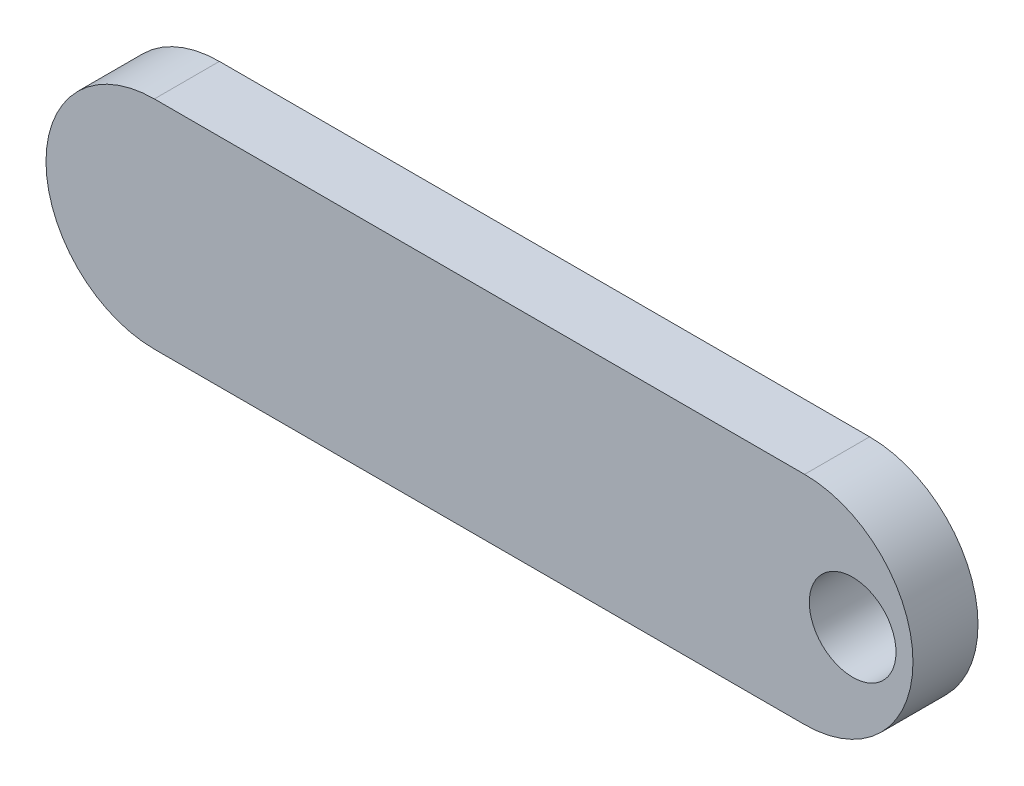
ISO-10303-21;
HEADER;
FILE_DESCRIPTION(('STEP AP214'),'2;1');
FILE_NAME('part.step','',(''),(''),'','','');
FILE_SCHEMA(('AUTOMOTIVE_DESIGN { 1 0 10303 214 1 1 1 1 }'));
ENDSEC;
DATA;
#1=APPLICATION_CONTEXT('core data for automotive mechanical design processes');
#2=APPLICATION_PROTOCOL_DEFINITION('international standard','automotive_design',2000,#1);
#3=PRODUCT_CONTEXT('',#1,'mechanical');
#4=PRODUCT('Part','Part','',(#3));
#5=PRODUCT_RELATED_PRODUCT_CATEGORY('part','',(#4));
#6=PRODUCT_DEFINITION_FORMATION('','',#4);
#7=PRODUCT_DEFINITION_CONTEXT('part definition',#1,'design');
#8=PRODUCT_DEFINITION('design','',#6,#7);
#9=PRODUCT_DEFINITION_SHAPE('','',#8);
#10=(LENGTH_UNIT() NAMED_UNIT(*) SI_UNIT(.MILLI.,.METRE.));
#11=(NAMED_UNIT(*) PLANE_ANGLE_UNIT() SI_UNIT($,.RADIAN.));
#12=(NAMED_UNIT(*) SI_UNIT($,.STERADIAN.) SOLID_ANGLE_UNIT());
#13=UNCERTAINTY_MEASURE_WITH_UNIT(LENGTH_MEASURE(1.E-05),#10,'distance_accuracy_value','');
#14=(GEOMETRIC_REPRESENTATION_CONTEXT(3) GLOBAL_UNCERTAINTY_ASSIGNED_CONTEXT((#13)) GLOBAL_UNIT_ASSIGNED_CONTEXT((#10,
#11,#12)) REPRESENTATION_CONTEXT('',''));
#15=CARTESIAN_POINT('',(0.,0.,0.));
#16=DIRECTION('',(0.,0.,1.));
#17=DIRECTION('',(1.,0.,0.));
#18=AXIS2_PLACEMENT_3D('',#15,#16,#17);
#19=CARTESIAN_POINT('',(0.,0.,3.));
#20=DIRECTION('',(0.,0.,-1.));
#21=DIRECTION('',(-1.,0.,0.));
#22=AXIS2_PLACEMENT_3D('',#19,#20,#21);
#23=CYLINDRICAL_SURFACE('',#22,5.);
#24=CARTESIAN_POINT('',(0.,0.,0.));
#25=DIRECTION('',(0.,0.,1.));
#26=DIRECTION('',(1.,0.,0.));
#27=AXIS2_PLACEMENT_3D('',#24,#25,#26);
#28=CIRCLE('',#27,5.);
#29=CARTESIAN_POINT('',(0.,5.,0.));
#30=VERTEX_POINT('',#29);
#31=CARTESIAN_POINT('',(0.,-5.,0.));
#32=VERTEX_POINT('',#31);
#33=EDGE_CURVE('E95',#30,#32,#28,.T.);
#34=ORIENTED_EDGE('',*,*,#33,.T.);
#35=DIRECTION('',(0.,0.,-1.));
#36=VECTOR('',#35,1.);
#37=CARTESIAN_POINT('',(0.,-5.,3.));
#38=LINE('',#37,#36);
#39=CARTESIAN_POINT('',(0.,-5.,3.));
#40=VERTEX_POINT('',#39);
#41=EDGE_CURVE('E11',#40,#32,#38,.T.);
#42=ORIENTED_EDGE('',*,*,#41,.F.);
#43=CARTESIAN_POINT('',(0.,0.,3.));
#44=DIRECTION('',(0.,0.,1.));
#45=DIRECTION('',(1.,0.,0.));
#46=AXIS2_PLACEMENT_3D('',#43,#44,#45);
#47=CIRCLE('',#46,5.);
#48=CARTESIAN_POINT('',(0.,5.,3.));
#49=VERTEX_POINT('',#48);
#50=EDGE_CURVE('E83',#49,#40,#47,.T.);
#51=ORIENTED_EDGE('',*,*,#50,.F.);
#52=DIRECTION('',(0.,0.,-1.));
#53=VECTOR('',#52,1.);
#54=CARTESIAN_POINT('',(0.,5.,3.));
#55=LINE('',#54,#53);
#56=EDGE_CURVE('E91',#49,#30,#55,.T.);
#57=ORIENTED_EDGE('',*,*,#56,.T.);
#58=EDGE_LOOP('',(#34,#42,#51,#57));
#59=FACE_BOUND('',#58,.T.);
#60=ADVANCED_FACE('F32',(#59),#23,.T.);
#61=CARTESIAN_POINT('',(0.,-5.,3.));
#62=DIRECTION('',(0.,1.,0.));
#63=DIRECTION('',(0.,0.,1.));
#64=AXIS2_PLACEMENT_3D('',#61,#62,#63);
#65=PLANE('',#64);
#66=DIRECTION('',(1.,0.,0.));
#67=VECTOR('',#66,1.);
#68=CARTESIAN_POINT('',(0.,-5.,0.));
#69=LINE('',#68,#67);
#70=CARTESIAN_POINT('',(30.,-5.,0.));
#71=VERTEX_POINT('',#70);
#72=EDGE_CURVE('E87',#32,#71,#69,.T.);
#73=ORIENTED_EDGE('',*,*,#72,.T.);
#74=DIRECTION('',(0.,0.,-1.));
#75=VECTOR('',#74,1.);
#76=CARTESIAN_POINT('',(30.,-5.,3.));
#77=LINE('',#76,#75);
#78=CARTESIAN_POINT('',(30.,-5.,3.));
#79=VERTEX_POINT('',#78);
#80=EDGE_CURVE('E40',#79,#71,#77,.T.);
#81=ORIENTED_EDGE('',*,*,#80,.F.);
#82=DIRECTION('',(1.,0.,0.));
#83=VECTOR('',#82,1.);
#84=CARTESIAN_POINT('',(0.,-5.,3.));
#85=LINE('',#84,#83);
#86=EDGE_CURVE('E78',#40,#79,#85,.T.);
#87=ORIENTED_EDGE('',*,*,#86,.F.);
#88=ORIENTED_EDGE('',*,*,#41,.T.);
#89=EDGE_LOOP('',(#73,#81,#87,#88));
#90=FACE_BOUND('',#89,.T.);
#91=ADVANCED_FACE('F86',(#90),#65,.F.);
#92=CARTESIAN_POINT('',(30.,0.,3.));
#93=DIRECTION('',(0.,0.,-1.));
#94=DIRECTION('',(-1.,0.,0.));
#95=AXIS2_PLACEMENT_3D('',#92,#93,#94);
#96=CYLINDRICAL_SURFACE('',#95,5.);
#97=CARTESIAN_POINT('',(30.,0.,0.));
#98=DIRECTION('',(0.,0.,1.));
#99=DIRECTION('',(1.,0.,0.));
#100=AXIS2_PLACEMENT_3D('',#97,#98,#99);
#101=CIRCLE('',#100,5.);
#102=CARTESIAN_POINT('',(30.,5.,0.));
#103=VERTEX_POINT('',#102);
#104=EDGE_CURVE('E65',#71,#103,#101,.T.);
#105=ORIENTED_EDGE('',*,*,#104,.T.);
#106=DIRECTION('',(0.,0.,-1.));
#107=VECTOR('',#106,1.);
#108=CARTESIAN_POINT('',(30.,5.,3.));
#109=LINE('',#108,#107);
#110=CARTESIAN_POINT('',(30.,5.,3.));
#111=VERTEX_POINT('',#110);
#112=EDGE_CURVE('E88',#111,#103,#109,.T.);
#113=ORIENTED_EDGE('',*,*,#112,.F.);
#114=CARTESIAN_POINT('',(30.,0.,3.));
#115=DIRECTION('',(0.,0.,1.));
#116=DIRECTION('',(1.,0.,0.));
#117=AXIS2_PLACEMENT_3D('',#114,#115,#116);
#118=CIRCLE('',#117,5.);
#119=EDGE_CURVE('E81',#79,#111,#118,.T.);
#120=ORIENTED_EDGE('',*,*,#119,.F.);
#121=ORIENTED_EDGE('',*,*,#80,.T.);
#122=EDGE_LOOP('',(#105,#113,#120,#121));
#123=FACE_BOUND('',#122,.T.);
#124=ADVANCED_FACE('F89',(#123),#96,.T.);
#125=CARTESIAN_POINT('',(0.,5.,3.));
#126=DIRECTION('',(0.,-1.,0.));
#127=DIRECTION('',(0.,0.,-1.));
#128=AXIS2_PLACEMENT_3D('',#125,#126,#127);
#129=PLANE('',#128);
#130=DIRECTION('',(-1.,0.,0.));
#131=VECTOR('',#130,1.);
#132=CARTESIAN_POINT('',(0.,5.,0.));
#133=LINE('',#132,#131);
#134=EDGE_CURVE('E71',#103,#30,#133,.T.);
#135=ORIENTED_EDGE('',*,*,#134,.T.);
#136=ORIENTED_EDGE('',*,*,#56,.F.);
#137=DIRECTION('',(-1.,0.,0.));
#138=VECTOR('',#137,1.);
#139=CARTESIAN_POINT('',(0.,5.,3.));
#140=LINE('',#139,#138);
#141=EDGE_CURVE('E48',#111,#49,#140,.T.);
#142=ORIENTED_EDGE('',*,*,#141,.F.);
#143=ORIENTED_EDGE('',*,*,#112,.T.);
#144=EDGE_LOOP('',(#135,#136,#142,#143));
#145=FACE_BOUND('',#144,.T.);
#146=ADVANCED_FACE('F103',(#145),#129,.F.);
#147=CARTESIAN_POINT('',(0.,0.,3.));
#148=DIRECTION('',(0.,0.,1.));
#149=DIRECTION('',(1.,0.,0.));
#150=AXIS2_PLACEMENT_3D('',#147,#148,#149);
#151=PLANE('',#150);
#152=CARTESIAN_POINT('',(32.2173234129224,0.,3.));
#153=DIRECTION('',(0.,0.,1.));
#154=DIRECTION('',(1.,0.,0.));
#155=AXIS2_PLACEMENT_3D('',#152,#153,#154);
#156=CIRCLE('',#155,2.);
#157=CARTESIAN_POINT('',(34.2173234129224,0.,3.));
#158=VERTEX_POINT('',#157);
#159=EDGE_CURVE('E109',#158,#158,#156,.T.);
#160=ORIENTED_EDGE('',*,*,#159,.F.);
#161=EDGE_LOOP('',(#160));
#162=FACE_BOUND('',#161,.T.);
#163=ORIENTED_EDGE('',*,*,#50,.T.);
#164=ORIENTED_EDGE('',*,*,#86,.T.);
#165=ORIENTED_EDGE('',*,*,#119,.T.);
#166=ORIENTED_EDGE('',*,*,#141,.T.);
#167=EDGE_LOOP('',(#163,#164,#165,#166));
#168=FACE_BOUND('',#167,.T.);
#169=ADVANCED_FACE('F79',(#162,#168),#151,.T.);
#170=CARTESIAN_POINT('',(0.,0.,0.));
#171=DIRECTION('',(0.,0.,1.));
#172=DIRECTION('',(1.,0.,0.));
#173=AXIS2_PLACEMENT_3D('',#170,#171,#172);
#174=PLANE('',#173);
#175=CARTESIAN_POINT('',(32.2173234129224,0.,0.));
#176=DIRECTION('',(0.,0.,1.));
#177=DIRECTION('',(1.,0.,0.));
#178=AXIS2_PLACEMENT_3D('',#175,#176,#177);
#179=CIRCLE('',#178,2.);
#180=CARTESIAN_POINT('',(34.2173234129224,0.,0.));
#181=VERTEX_POINT('',#180);
#182=EDGE_CURVE('E98',#181,#181,#179,.T.);
#183=ORIENTED_EDGE('',*,*,#182,.T.);
#184=EDGE_LOOP('',(#183));
#185=FACE_BOUND('',#184,.T.);
#186=ORIENTED_EDGE('',*,*,#33,.F.);
#187=ORIENTED_EDGE('',*,*,#134,.F.);
#188=ORIENTED_EDGE('',*,*,#104,.F.);
#189=ORIENTED_EDGE('',*,*,#72,.F.);
#190=EDGE_LOOP('',(#186,#187,#188,#189));
#191=FACE_BOUND('',#190,.T.);
#192=ADVANCED_FACE('F106',(#185,#191),#174,.F.);
#193=CARTESIAN_POINT('',(32.2173234129224,0.,0.));
#194=DIRECTION('',(0.,0.,1.));
#195=DIRECTION('',(1.,0.,0.));
#196=AXIS2_PLACEMENT_3D('',#193,#194,#195);
#197=CYLINDRICAL_SURFACE('',#196,2.);
#198=ORIENTED_EDGE('',*,*,#182,.F.);
#199=EDGE_LOOP('',(#198));
#200=FACE_BOUND('',#199,.T.);
#201=ORIENTED_EDGE('',*,*,#159,.T.);
#202=EDGE_LOOP('',(#201));
#203=FACE_BOUND('',#202,.T.);
#204=ADVANCED_FACE('F116',(#200,#203),#197,.F.);
#205=CLOSED_SHELL('',(#60,#91,#124,#146,#169,#192,#204));
#206=MANIFOLD_SOLID_BREP('B2',#205);
#207=ADVANCED_BREP_SHAPE_REPRESENTATION('',(#18,#206),#14);
#208=SHAPE_DEFINITION_REPRESENTATION(#9,#207);
ENDSEC;
END-ISO-10303-21;
